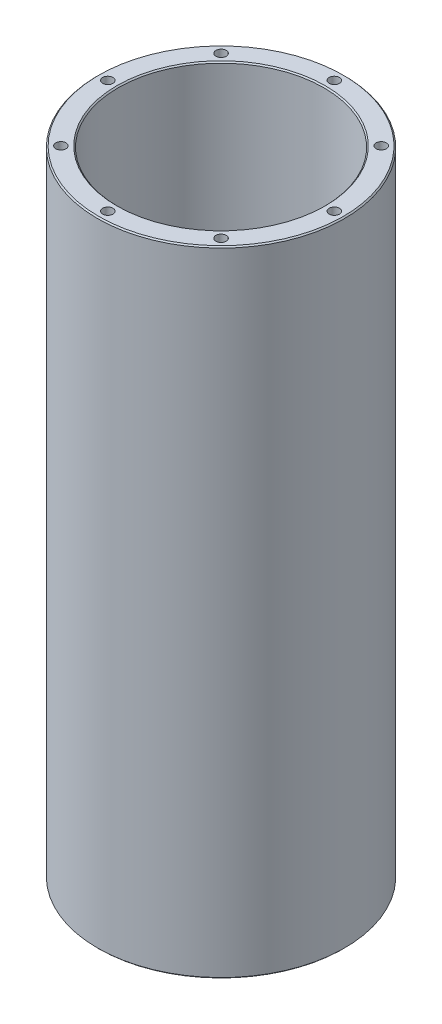
ISO-10303-21;
HEADER;
FILE_DESCRIPTION(('STEP AP214'),'2;1');
FILE_NAME('part.step','',(''),(''),'','','');
FILE_SCHEMA(('AUTOMOTIVE_DESIGN { 1 0 10303 214 1 1 1 1 }'));
ENDSEC;
DATA;
#1=APPLICATION_CONTEXT('core data for automotive mechanical design processes');
#2=APPLICATION_PROTOCOL_DEFINITION('international standard','automotive_design',2000,#1);
#3=PRODUCT_CONTEXT('',#1,'mechanical');
#4=PRODUCT('Part','Part','',(#3));
#5=PRODUCT_RELATED_PRODUCT_CATEGORY('part','',(#4));
#6=PRODUCT_DEFINITION_FORMATION('','',#4);
#7=PRODUCT_DEFINITION_CONTEXT('part definition',#1,'design');
#8=PRODUCT_DEFINITION('design','',#6,#7);
#9=PRODUCT_DEFINITION_SHAPE('','',#8);
#10=(LENGTH_UNIT() NAMED_UNIT(*) SI_UNIT(.MILLI.,.METRE.));
#11=(NAMED_UNIT(*) PLANE_ANGLE_UNIT() SI_UNIT($,.RADIAN.));
#12=(NAMED_UNIT(*) SI_UNIT($,.STERADIAN.) SOLID_ANGLE_UNIT());
#13=UNCERTAINTY_MEASURE_WITH_UNIT(LENGTH_MEASURE(1.E-05),#10,'distance_accuracy_value','');
#14=(GEOMETRIC_REPRESENTATION_CONTEXT(3) GLOBAL_UNCERTAINTY_ASSIGNED_CONTEXT((#13)) GLOBAL_UNIT_ASSIGNED_CONTEXT((#10,
#11,#12)) REPRESENTATION_CONTEXT('',''));
#15=CARTESIAN_POINT('',(0.,0.,0.));
#16=DIRECTION('',(0.,0.,1.));
#17=DIRECTION('',(1.,0.,0.));
#18=AXIS2_PLACEMENT_3D('',#15,#16,#17);
#19=CARTESIAN_POINT('',(0.,154.,0.));
#20=DIRECTION('',(0.,1.,0.));
#21=DIRECTION('',(0.,0.,1.));
#22=AXIS2_PLACEMENT_3D('',#19,#20,#21);
#23=PLANE('',#22);
#24=CARTESIAN_POINT('',(0.,154.,0.));
#25=DIRECTION('',(0.,1.,0.));
#26=DIRECTION('',(0.,0.,1.));
#27=AXIS2_PLACEMENT_3D('',#24,#25,#26);
#28=CIRCLE('',#27,50.6);
#29=CARTESIAN_POINT('',(0.,154.,50.6));
#30=VERTEX_POINT('',#29);
#31=EDGE_CURVE('E14',#30,#30,#28,.F.);
#32=ORIENTED_EDGE('',*,*,#31,.T.);
#33=EDGE_LOOP('',(#32));
#34=FACE_BOUND('',#33,.T.);
#35=CARTESIAN_POINT('',(0.,154.,0.));
#36=DIRECTION('',(0.,1.,0.));
#37=DIRECTION('',(0.,0.,1.));
#38=AXIS2_PLACEMENT_3D('',#35,#36,#37);
#39=CIRCLE('',#38,59.4);
#40=CARTESIAN_POINT('',(0.,154.,59.4));
#41=VERTEX_POINT('',#40);
#42=EDGE_CURVE('E177',#41,#41,#39,.T.);
#43=ORIENTED_EDGE('',*,*,#42,.T.);
#44=EDGE_LOOP('',(#43));
#45=FACE_BOUND('',#44,.T.);
#46=CARTESIAN_POINT('',(0.,154.,-55.));
#47=DIRECTION('',(0.,1.,0.));
#48=DIRECTION('',(0.,0.,1.));
#49=AXIS2_PLACEMENT_3D('',#46,#47,#48);
#50=CIRCLE('',#49,2.49999999999999);
#51=CARTESIAN_POINT('',(0.,154.,-52.5));
#52=VERTEX_POINT('',#51);
#53=EDGE_CURVE('E312',#52,#52,#50,.T.);
#54=ORIENTED_EDGE('',*,*,#53,.F.);
#55=EDGE_LOOP('',(#54));
#56=FACE_BOUND('',#55,.T.);
#57=CARTESIAN_POINT('',(38.8908729652619,154.,-38.8908729652583));
#58=DIRECTION('',(0.,1.,0.));
#59=DIRECTION('',(0.,0.,1.));
#60=AXIS2_PLACEMENT_3D('',#57,#58,#59);
#61=CIRCLE('',#60,2.49999999999999);
#62=CARTESIAN_POINT('',(38.8908729652619,154.,-36.3908729652583));
#63=VERTEX_POINT('',#62);
#64=EDGE_CURVE('E320',#63,#63,#61,.T.);
#65=ORIENTED_EDGE('',*,*,#64,.F.);
#66=EDGE_LOOP('',(#65));
#67=FACE_BOUND('',#66,.T.);
#68=CARTESIAN_POINT('',(55.,154.,5.19321613705065E-12));
#69=DIRECTION('',(0.,1.,0.));
#70=DIRECTION('',(0.,0.,1.));
#71=AXIS2_PLACEMENT_3D('',#68,#69,#70);
#72=CIRCLE('',#71,2.49999999999999);
#73=CARTESIAN_POINT('',(55.,154.,2.50000000000518));
#74=VERTEX_POINT('',#73);
#75=EDGE_CURVE('E328',#74,#74,#72,.T.);
#76=ORIENTED_EDGE('',*,*,#75,.F.);
#77=EDGE_LOOP('',(#76));
#78=FACE_BOUND('',#77,.T.);
#79=CARTESIAN_POINT('',(38.8908729652546,154.,38.8908729652656));
#80=DIRECTION('',(0.,1.,0.));
#81=DIRECTION('',(0.,0.,1.));
#82=AXIS2_PLACEMENT_3D('',#79,#80,#81);
#83=CIRCLE('',#82,2.49999999999999);
#84=CARTESIAN_POINT('',(38.8908729652546,154.,41.3908729652656));
#85=VERTEX_POINT('',#84);
#86=EDGE_CURVE('E336',#85,#85,#83,.T.);
#87=ORIENTED_EDGE('',*,*,#86,.F.);
#88=EDGE_LOOP('',(#87));
#89=FACE_BOUND('',#88,.T.);
#90=CARTESIAN_POINT('',(-1.03923534517465E-11,154.,55.));
#91=DIRECTION('',(0.,1.,0.));
#92=DIRECTION('',(0.,0.,1.));
#93=AXIS2_PLACEMENT_3D('',#90,#91,#92);
#94=CIRCLE('',#93,2.49999999999999);
#95=CARTESIAN_POINT('',(-1.03923534517465E-11,154.,57.5));
#96=VERTEX_POINT('',#95);
#97=EDGE_CURVE('E344',#96,#96,#94,.T.);
#98=ORIENTED_EDGE('',*,*,#97,.F.);
#99=EDGE_LOOP('',(#98));
#100=FACE_BOUND('',#99,.T.);
#101=CARTESIAN_POINT('',(-38.8908729652693,154.,38.8908729652509));
#102=DIRECTION('',(0.,1.,0.));
#103=DIRECTION('',(0.,0.,1.));
#104=AXIS2_PLACEMENT_3D('',#101,#102,#103);
#105=CIRCLE('',#104,2.49999999999999);
#106=CARTESIAN_POINT('',(-38.8908729652693,154.,41.3908729652509));
#107=VERTEX_POINT('',#106);
#108=EDGE_CURVE('E352',#107,#107,#105,.T.);
#109=ORIENTED_EDGE('',*,*,#108,.F.);
#110=EDGE_LOOP('',(#109));
#111=FACE_BOUND('',#110,.T.);
#112=CARTESIAN_POINT('',(-55.,154.,-1.56159156729841E-11));
#113=DIRECTION('',(0.,1.,0.));
#114=DIRECTION('',(0.,0.,1.));
#115=AXIS2_PLACEMENT_3D('',#112,#113,#114);
#116=CIRCLE('',#115,2.49999999999999);
#117=CARTESIAN_POINT('',(-55.,154.,2.49999999998437));
#118=VERTEX_POINT('',#117);
#119=EDGE_CURVE('E360',#118,#118,#116,.T.);
#120=ORIENTED_EDGE('',*,*,#119,.F.);
#121=EDGE_LOOP('',(#120));
#122=FACE_BOUND('',#121,.T.);
#123=CARTESIAN_POINT('',(-38.8908729652472,154.,-38.890872965273));
#124=DIRECTION('',(0.,1.,0.));
#125=DIRECTION('',(0.,0.,1.));
#126=AXIS2_PLACEMENT_3D('',#123,#124,#125);
#127=CIRCLE('',#126,2.49999999999999);
#128=CARTESIAN_POINT('',(-38.8908729652472,154.,-36.390872965273));
#129=VERTEX_POINT('',#128);
#130=EDGE_CURVE('E368',#129,#129,#127,.T.);
#131=ORIENTED_EDGE('',*,*,#130,.F.);
#132=EDGE_LOOP('',(#131));
#133=FACE_BOUND('',#132,.T.);
#134=ADVANCED_FACE('F167',(#34,#45,#56,#67,#78,#89,#100,#111,#122,#133),#23,.T.);
#135=CARTESIAN_POINT('',(0.,154.,0.));
#136=DIRECTION('',(0.,-1.,0.));
#137=DIRECTION('',(0.,0.,-1.));
#138=AXIS2_PLACEMENT_3D('',#135,#136,#137);
#139=CYLINDRICAL_SURFACE('',#138,60.);
#140=CARTESIAN_POINT('',(0.,-153.4,0.));
#141=DIRECTION('',(0.,1.,0.));
#142=DIRECTION('',(0.,0.,1.));
#143=AXIS2_PLACEMENT_3D('',#140,#141,#142);
#144=CIRCLE('',#143,60.);
#145=CARTESIAN_POINT('',(0.,-153.4,60.));
#146=VERTEX_POINT('',#145);
#147=EDGE_CURVE('E396',#146,#146,#144,.T.);
#148=ORIENTED_EDGE('',*,*,#147,.T.);
#149=EDGE_LOOP('',(#148));
#150=FACE_BOUND('',#149,.T.);
#151=CARTESIAN_POINT('',(0.,153.4,0.));
#152=DIRECTION('',(0.,1.,0.));
#153=DIRECTION('',(0.,0.,1.));
#154=AXIS2_PLACEMENT_3D('',#151,#152,#153);
#155=CIRCLE('',#154,60.);
#156=CARTESIAN_POINT('',(0.,153.4,60.));
#157=VERTEX_POINT('',#156);
#158=EDGE_CURVE('E392',#157,#157,#155,.F.);
#159=ORIENTED_EDGE('',*,*,#158,.T.);
#160=EDGE_LOOP('',(#159));
#161=FACE_BOUND('',#160,.T.);
#162=ADVANCED_FACE('F417',(#150,#161),#139,.T.);
#163=CARTESIAN_POINT('',(0.,154.,0.));
#164=DIRECTION('',(0.,-1.,0.));
#165=DIRECTION('',(0.,0.,-1.));
#166=AXIS2_PLACEMENT_3D('',#163,#164,#165);
#167=CYLINDRICAL_SURFACE('',#166,50.);
#168=CARTESIAN_POINT('',(0.,-153.4,0.));
#169=DIRECTION('',(0.,1.,0.));
#170=DIRECTION('',(0.,0.,1.));
#171=AXIS2_PLACEMENT_3D('',#168,#169,#170);
#172=CIRCLE('',#171,50.);
#173=CARTESIAN_POINT('',(0.,-153.4,50.));
#174=VERTEX_POINT('',#173);
#175=EDGE_CURVE('E388',#174,#174,#172,.F.);
#176=ORIENTED_EDGE('',*,*,#175,.T.);
#177=EDGE_LOOP('',(#176));
#178=FACE_BOUND('',#177,.T.);
#179=CARTESIAN_POINT('',(0.,153.4,0.));
#180=DIRECTION('',(0.,1.,0.));
#181=DIRECTION('',(0.,0.,1.));
#182=AXIS2_PLACEMENT_3D('',#179,#180,#181);
#183=CIRCLE('',#182,50.);
#184=CARTESIAN_POINT('',(0.,153.4,50.));
#185=VERTEX_POINT('',#184);
#186=EDGE_CURVE('E384',#185,#185,#183,.T.);
#187=ORIENTED_EDGE('',*,*,#186,.T.);
#188=EDGE_LOOP('',(#187));
#189=FACE_BOUND('',#188,.T.);
#190=ADVANCED_FACE('F425',(#178,#189),#167,.F.);
#191=CARTESIAN_POINT('',(0.,-154.,0.));
#192=DIRECTION('',(0.,1.,0.));
#193=DIRECTION('',(0.,0.,1.));
#194=AXIS2_PLACEMENT_3D('',#191,#192,#193);
#195=PLANE('',#194);
#196=CARTESIAN_POINT('',(0.,-154.,0.));
#197=DIRECTION('',(0.,1.,0.));
#198=DIRECTION('',(0.,0.,1.));
#199=AXIS2_PLACEMENT_3D('',#196,#197,#198);
#200=CIRCLE('',#199,50.6);
#201=CARTESIAN_POINT('',(0.,-154.,50.6));
#202=VERTEX_POINT('',#201);
#203=EDGE_CURVE('E380',#202,#202,#200,.T.);
#204=ORIENTED_EDGE('',*,*,#203,.T.);
#205=EDGE_LOOP('',(#204));
#206=FACE_BOUND('',#205,.T.);
#207=CARTESIAN_POINT('',(0.,-154.,0.));
#208=DIRECTION('',(0.,1.,0.));
#209=DIRECTION('',(0.,0.,1.));
#210=AXIS2_PLACEMENT_3D('',#207,#208,#209);
#211=CIRCLE('',#210,59.4);
#212=CARTESIAN_POINT('',(0.,-154.,59.4));
#213=VERTEX_POINT('',#212);
#214=EDGE_CURVE('E376',#213,#213,#211,.F.);
#215=ORIENTED_EDGE('',*,*,#214,.T.);
#216=EDGE_LOOP('',(#215));
#217=FACE_BOUND('',#216,.T.);
#218=CARTESIAN_POINT('',(0.,-154.,-55.));
#219=DIRECTION('',(0.,-1.,0.));
#220=DIRECTION('',(0.,0.,-1.));
#221=AXIS2_PLACEMENT_3D('',#218,#219,#220);
#222=CIRCLE('',#221,2.49999999999999);
#223=CARTESIAN_POINT('',(0.,-154.,-57.5));
#224=VERTEX_POINT('',#223);
#225=EDGE_CURVE('E249',#224,#224,#222,.T.);
#226=ORIENTED_EDGE('',*,*,#225,.F.);
#227=EDGE_LOOP('',(#226));
#228=FACE_BOUND('',#227,.T.);
#229=CARTESIAN_POINT('',(38.8908729652619,-154.,-38.8908729652583));
#230=DIRECTION('',(0.,-1.,0.));
#231=DIRECTION('',(0.,0.,-1.));
#232=AXIS2_PLACEMENT_3D('',#229,#230,#231);
#233=CIRCLE('',#232,2.49999999999999);
#234=CARTESIAN_POINT('',(38.8908729652619,-154.,-41.3908729652583));
#235=VERTEX_POINT('',#234);
#236=EDGE_CURVE('E248',#235,#235,#233,.T.);
#237=ORIENTED_EDGE('',*,*,#236,.F.);
#238=EDGE_LOOP('',(#237));
#239=FACE_BOUND('',#238,.T.);
#240=CARTESIAN_POINT('',(55.,-154.,5.19321613705065E-12));
#241=DIRECTION('',(0.,-1.,0.));
#242=DIRECTION('',(0.,0.,-1.));
#243=AXIS2_PLACEMENT_3D('',#240,#241,#242);
#244=CIRCLE('',#243,2.49999999999999);
#245=CARTESIAN_POINT('',(55.,-154.,-2.49999999999479));
#246=VERTEX_POINT('',#245);
#247=EDGE_CURVE('E264',#246,#246,#244,.T.);
#248=ORIENTED_EDGE('',*,*,#247,.F.);
#249=EDGE_LOOP('',(#248));
#250=FACE_BOUND('',#249,.T.);
#251=CARTESIAN_POINT('',(38.8908729652546,-154.,38.8908729652656));
#252=DIRECTION('',(0.,-1.,0.));
#253=DIRECTION('',(0.,0.,-1.));
#254=AXIS2_PLACEMENT_3D('',#251,#252,#253);
#255=CIRCLE('',#254,2.49999999999999);
#256=CARTESIAN_POINT('',(38.8908729652546,-154.,36.3908729652656));
#257=VERTEX_POINT('',#256);
#258=EDGE_CURVE('E272',#257,#257,#255,.T.);
#259=ORIENTED_EDGE('',*,*,#258,.F.);
#260=EDGE_LOOP('',(#259));
#261=FACE_BOUND('',#260,.T.);
#262=CARTESIAN_POINT('',(-1.03923534517465E-11,-154.,55.));
#263=DIRECTION('',(0.,-1.,0.));
#264=DIRECTION('',(0.,0.,-1.));
#265=AXIS2_PLACEMENT_3D('',#262,#263,#264);
#266=CIRCLE('',#265,2.49999999999999);
#267=CARTESIAN_POINT('',(-1.03923534517465E-11,-154.,52.5));
#268=VERTEX_POINT('',#267);
#269=EDGE_CURVE('E280',#268,#268,#266,.T.);
#270=ORIENTED_EDGE('',*,*,#269,.F.);
#271=EDGE_LOOP('',(#270));
#272=FACE_BOUND('',#271,.T.);
#273=CARTESIAN_POINT('',(-38.8908729652693,-154.,38.8908729652509));
#274=DIRECTION('',(0.,-1.,0.));
#275=DIRECTION('',(0.,0.,-1.));
#276=AXIS2_PLACEMENT_3D('',#273,#274,#275);
#277=CIRCLE('',#276,2.49999999999999);
#278=CARTESIAN_POINT('',(-38.8908729652693,-154.,36.390872965251));
#279=VERTEX_POINT('',#278);
#280=EDGE_CURVE('E288',#279,#279,#277,.T.);
#281=ORIENTED_EDGE('',*,*,#280,.F.);
#282=EDGE_LOOP('',(#281));
#283=FACE_BOUND('',#282,.T.);
#284=CARTESIAN_POINT('',(-55.,-154.,-1.56159156729841E-11));
#285=DIRECTION('',(0.,-1.,0.));
#286=DIRECTION('',(0.,0.,-1.));
#287=AXIS2_PLACEMENT_3D('',#284,#285,#286);
#288=CIRCLE('',#287,2.49999999999999);
#289=CARTESIAN_POINT('',(-55.,-154.,-2.5000000000156));
#290=VERTEX_POINT('',#289);
#291=EDGE_CURVE('E296',#290,#290,#288,.T.);
#292=ORIENTED_EDGE('',*,*,#291,.F.);
#293=EDGE_LOOP('',(#292));
#294=FACE_BOUND('',#293,.T.);
#295=CARTESIAN_POINT('',(-38.8908729652472,-154.,-38.890872965273));
#296=DIRECTION('',(0.,-1.,0.));
#297=DIRECTION('',(0.,0.,-1.));
#298=AXIS2_PLACEMENT_3D('',#295,#296,#297);
#299=CIRCLE('',#298,2.49999999999999);
#300=CARTESIAN_POINT('',(-38.8908729652472,-154.,-41.390872965273));
#301=VERTEX_POINT('',#300);
#302=EDGE_CURVE('E304',#301,#301,#299,.T.);
#303=ORIENTED_EDGE('',*,*,#302,.F.);
#304=EDGE_LOOP('',(#303));
#305=FACE_BOUND('',#304,.T.);
#306=ADVANCED_FACE('F455',(#206,#217,#228,#239,#250,#261,#272,#283,#294,#305),#195,.F.);
#307=CARTESIAN_POINT('',(-38.8908729652472,139.,-38.890872965273));
#308=DIRECTION('',(0.,1.,0.));
#309=DIRECTION('',(0.,0.,1.));
#310=AXIS2_PLACEMENT_3D('',#307,#308,#309);
#311=CONICAL_SURFACE('',#310,2.49999999999999,1.02974425867665);
#312=CARTESIAN_POINT('',(-38.8908729652473,137.497848452431,-38.890872965273));
#313=VERTEX_POINT('',#312);
#314=VERTEX_LOOP('',#313);
#315=FACE_BOUND('',#314,.T.);
#316=CARTESIAN_POINT('',(-38.8908729652472,139.,-38.890872965273));
#317=DIRECTION('',(0.,1.,0.));
#318=DIRECTION('',(0.,0.,1.));
#319=AXIS2_PLACEMENT_3D('',#316,#317,#318);
#320=CIRCLE('',#319,2.49999999999999);
#321=CARTESIAN_POINT('',(-38.8908729652472,139.,-36.390872965273));
#322=VERTEX_POINT('',#321);
#323=EDGE_CURVE('E372',#322,#322,#320,.T.);
#324=ORIENTED_EDGE('',*,*,#323,.T.);
#325=EDGE_LOOP('',(#324));
#326=FACE_BOUND('',#325,.T.);
#327=ADVANCED_FACE('F458',(#315,#326),#311,.F.);
#328=CARTESIAN_POINT('',(-38.8908729652472,154.,-38.890872965273));
#329=DIRECTION('',(0.,1.,0.));
#330=DIRECTION('',(0.,0.,1.));
#331=AXIS2_PLACEMENT_3D('',#328,#329,#330);
#332=CYLINDRICAL_SURFACE('',#331,2.49999999999999);
#333=ORIENTED_EDGE('',*,*,#323,.F.);
#334=EDGE_LOOP('',(#333));
#335=FACE_BOUND('',#334,.T.);
#336=ORIENTED_EDGE('',*,*,#130,.T.);
#337=EDGE_LOOP('',(#336));
#338=FACE_BOUND('',#337,.T.);
#339=ADVANCED_FACE('F549',(#335,#338),#332,.F.);
#340=CARTESIAN_POINT('',(-55.,139.,-1.56159156729841E-11));
#341=DIRECTION('',(0.,1.,0.));
#342=DIRECTION('',(0.,0.,1.));
#343=AXIS2_PLACEMENT_3D('',#340,#341,#342);
#344=CONICAL_SURFACE('',#343,2.49999999999999,1.02974425867665);
#345=CARTESIAN_POINT('',(-55.,137.497848452431,-1.56159156729841E-11));
#346=VERTEX_POINT('',#345);
#347=VERTEX_LOOP('',#346);
#348=FACE_BOUND('',#347,.T.);
#349=CARTESIAN_POINT('',(-55.,139.,-1.56159156729841E-11));
#350=DIRECTION('',(0.,1.,0.));
#351=DIRECTION('',(0.,0.,1.));
#352=AXIS2_PLACEMENT_3D('',#349,#350,#351);
#353=CIRCLE('',#352,2.49999999999999);
#354=CARTESIAN_POINT('',(-55.,139.,2.49999999998437));
#355=VERTEX_POINT('',#354);
#356=EDGE_CURVE('E364',#355,#355,#353,.T.);
#357=ORIENTED_EDGE('',*,*,#356,.T.);
#358=EDGE_LOOP('',(#357));
#359=FACE_BOUND('',#358,.T.);
#360=ADVANCED_FACE('F545',(#348,#359),#344,.F.);
#361=CARTESIAN_POINT('',(-55.,154.,-1.56159156729841E-11));
#362=DIRECTION('',(0.,1.,0.));
#363=DIRECTION('',(0.,0.,1.));
#364=AXIS2_PLACEMENT_3D('',#361,#362,#363);
#365=CYLINDRICAL_SURFACE('',#364,2.49999999999999);
#366=ORIENTED_EDGE('',*,*,#356,.F.);
#367=EDGE_LOOP('',(#366));
#368=FACE_BOUND('',#367,.T.);
#369=ORIENTED_EDGE('',*,*,#119,.T.);
#370=EDGE_LOOP('',(#369));
#371=FACE_BOUND('',#370,.T.);
#372=ADVANCED_FACE('F541',(#368,#371),#365,.F.);
#373=CARTESIAN_POINT('',(-38.8908729652693,139.,38.8908729652509));
#374=DIRECTION('',(0.,1.,0.));
#375=DIRECTION('',(0.,0.,1.));
#376=AXIS2_PLACEMENT_3D('',#373,#374,#375);
#377=CONICAL_SURFACE('',#376,2.49999999999999,1.02974425867665);
#378=CARTESIAN_POINT('',(-38.8908729652693,137.497848452431,38.8908729652509));
#379=VERTEX_POINT('',#378);
#380=VERTEX_LOOP('',#379);
#381=FACE_BOUND('',#380,.T.);
#382=CARTESIAN_POINT('',(-38.8908729652693,139.,38.8908729652509));
#383=DIRECTION('',(0.,1.,0.));
#384=DIRECTION('',(0.,0.,1.));
#385=AXIS2_PLACEMENT_3D('',#382,#383,#384);
#386=CIRCLE('',#385,2.49999999999999);
#387=CARTESIAN_POINT('',(-38.8908729652693,139.,41.3908729652509));
#388=VERTEX_POINT('',#387);
#389=EDGE_CURVE('E356',#388,#388,#386,.T.);
#390=ORIENTED_EDGE('',*,*,#389,.T.);
#391=EDGE_LOOP('',(#390));
#392=FACE_BOUND('',#391,.T.);
#393=ADVANCED_FACE('F537',(#381,#392),#377,.F.);
#394=CARTESIAN_POINT('',(-38.8908729652693,154.,38.8908729652509));
#395=DIRECTION('',(0.,1.,0.));
#396=DIRECTION('',(0.,0.,1.));
#397=AXIS2_PLACEMENT_3D('',#394,#395,#396);
#398=CYLINDRICAL_SURFACE('',#397,2.49999999999999);
#399=ORIENTED_EDGE('',*,*,#389,.F.);
#400=EDGE_LOOP('',(#399));
#401=FACE_BOUND('',#400,.T.);
#402=ORIENTED_EDGE('',*,*,#108,.T.);
#403=EDGE_LOOP('',(#402));
#404=FACE_BOUND('',#403,.T.);
#405=ADVANCED_FACE('F533',(#401,#404),#398,.F.);
#406=CARTESIAN_POINT('',(-1.03923534517465E-11,139.,55.));
#407=DIRECTION('',(0.,1.,0.));
#408=DIRECTION('',(0.,0.,1.));
#409=AXIS2_PLACEMENT_3D('',#406,#407,#408);
#410=CONICAL_SURFACE('',#409,2.49999999999999,1.02974425867665);
#411=CARTESIAN_POINT('',(-1.03963953131608E-11,137.497848452431,55.));
#412=VERTEX_POINT('',#411);
#413=VERTEX_LOOP('',#412);
#414=FACE_BOUND('',#413,.T.);
#415=CARTESIAN_POINT('',(-1.03923534517465E-11,139.,55.));
#416=DIRECTION('',(0.,1.,0.));
#417=DIRECTION('',(0.,0.,1.));
#418=AXIS2_PLACEMENT_3D('',#415,#416,#417);
#419=CIRCLE('',#418,2.49999999999999);
#420=CARTESIAN_POINT('',(-1.03923534517465E-11,139.,57.5));
#421=VERTEX_POINT('',#420);
#422=EDGE_CURVE('E348',#421,#421,#419,.T.);
#423=ORIENTED_EDGE('',*,*,#422,.T.);
#424=EDGE_LOOP('',(#423));
#425=FACE_BOUND('',#424,.T.);
#426=ADVANCED_FACE('F529',(#414,#425),#410,.F.);
#427=CARTESIAN_POINT('',(-1.03923534517465E-11,154.,55.));
#428=DIRECTION('',(0.,1.,0.));
#429=DIRECTION('',(0.,0.,1.));
#430=AXIS2_PLACEMENT_3D('',#427,#428,#429);
#431=CYLINDRICAL_SURFACE('',#430,2.49999999999999);
#432=ORIENTED_EDGE('',*,*,#422,.F.);
#433=EDGE_LOOP('',(#432));
#434=FACE_BOUND('',#433,.T.);
#435=ORIENTED_EDGE('',*,*,#97,.T.);
#436=EDGE_LOOP('',(#435));
#437=FACE_BOUND('',#436,.T.);
#438=ADVANCED_FACE('F525',(#434,#437),#431,.F.);
#439=CARTESIAN_POINT('',(38.8908729652546,139.,38.8908729652656));
#440=DIRECTION('',(0.,1.,0.));
#441=DIRECTION('',(0.,0.,1.));
#442=AXIS2_PLACEMENT_3D('',#439,#440,#441);
#443=CONICAL_SURFACE('',#442,2.49999999999999,1.02974425867665);
#444=CARTESIAN_POINT('',(38.8908729652546,137.497848452431,38.8908729652656));
#445=VERTEX_POINT('',#444);
#446=VERTEX_LOOP('',#445);
#447=FACE_BOUND('',#446,.T.);
#448=CARTESIAN_POINT('',(38.8908729652546,139.,38.8908729652656));
#449=DIRECTION('',(0.,1.,0.));
#450=DIRECTION('',(0.,0.,1.));
#451=AXIS2_PLACEMENT_3D('',#448,#449,#450);
#452=CIRCLE('',#451,2.49999999999999);
#453=CARTESIAN_POINT('',(38.8908729652546,139.,41.3908729652656));
#454=VERTEX_POINT('',#453);
#455=EDGE_CURVE('E340',#454,#454,#452,.T.);
#456=ORIENTED_EDGE('',*,*,#455,.T.);
#457=EDGE_LOOP('',(#456));
#458=FACE_BOUND('',#457,.T.);
#459=ADVANCED_FACE('F521',(#447,#458),#443,.F.);
#460=CARTESIAN_POINT('',(38.8908729652546,154.,38.8908729652656));
#461=DIRECTION('',(0.,1.,0.));
#462=DIRECTION('',(0.,0.,1.));
#463=AXIS2_PLACEMENT_3D('',#460,#461,#462);
#464=CYLINDRICAL_SURFACE('',#463,2.49999999999999);
#465=ORIENTED_EDGE('',*,*,#455,.F.);
#466=EDGE_LOOP('',(#465));
#467=FACE_BOUND('',#466,.T.);
#468=ORIENTED_EDGE('',*,*,#86,.T.);
#469=EDGE_LOOP('',(#468));
#470=FACE_BOUND('',#469,.T.);
#471=ADVANCED_FACE('F517',(#467,#470),#464,.F.);
#472=CARTESIAN_POINT('',(55.,139.,5.19321613705065E-12));
#473=DIRECTION('',(0.,1.,0.));
#474=DIRECTION('',(0.,0.,1.));
#475=AXIS2_PLACEMENT_3D('',#472,#473,#474);
#476=CONICAL_SURFACE('',#475,2.49999999999999,1.02974425867665);
#477=CARTESIAN_POINT('',(55.,137.497848452431,5.19321613705065E-12));
#478=VERTEX_POINT('',#477);
#479=VERTEX_LOOP('',#478);
#480=FACE_BOUND('',#479,.T.);
#481=CARTESIAN_POINT('',(55.,139.,5.19321613705065E-12));
#482=DIRECTION('',(0.,1.,0.));
#483=DIRECTION('',(0.,0.,1.));
#484=AXIS2_PLACEMENT_3D('',#481,#482,#483);
#485=CIRCLE('',#484,2.49999999999999);
#486=CARTESIAN_POINT('',(55.,139.,2.50000000000518));
#487=VERTEX_POINT('',#486);
#488=EDGE_CURVE('E332',#487,#487,#485,.T.);
#489=ORIENTED_EDGE('',*,*,#488,.T.);
#490=EDGE_LOOP('',(#489));
#491=FACE_BOUND('',#490,.T.);
#492=ADVANCED_FACE('F513',(#480,#491),#476,.F.);
#493=CARTESIAN_POINT('',(55.,154.,5.19321613705065E-12));
#494=DIRECTION('',(0.,1.,0.));
#495=DIRECTION('',(0.,0.,1.));
#496=AXIS2_PLACEMENT_3D('',#493,#494,#495);
#497=CYLINDRICAL_SURFACE('',#496,2.49999999999999);
#498=ORIENTED_EDGE('',*,*,#488,.F.);
#499=EDGE_LOOP('',(#498));
#500=FACE_BOUND('',#499,.T.);
#501=ORIENTED_EDGE('',*,*,#75,.T.);
#502=EDGE_LOOP('',(#501));
#503=FACE_BOUND('',#502,.T.);
#504=ADVANCED_FACE('F509',(#500,#503),#497,.F.);
#505=CARTESIAN_POINT('',(38.8908729652619,139.,-38.8908729652583));
#506=DIRECTION('',(0.,1.,0.));
#507=DIRECTION('',(0.,0.,1.));
#508=AXIS2_PLACEMENT_3D('',#505,#506,#507);
#509=CONICAL_SURFACE('',#508,2.49999999999999,1.02974425867665);
#510=CARTESIAN_POINT('',(38.8908729652619,137.497848452431,-38.8908729652583));
#511=VERTEX_POINT('',#510);
#512=VERTEX_LOOP('',#511);
#513=FACE_BOUND('',#512,.T.);
#514=CARTESIAN_POINT('',(38.8908729652619,139.,-38.8908729652583));
#515=DIRECTION('',(0.,1.,0.));
#516=DIRECTION('',(0.,0.,1.));
#517=AXIS2_PLACEMENT_3D('',#514,#515,#516);
#518=CIRCLE('',#517,2.49999999999999);
#519=CARTESIAN_POINT('',(38.8908729652619,139.,-36.3908729652583));
#520=VERTEX_POINT('',#519);
#521=EDGE_CURVE('E324',#520,#520,#518,.T.);
#522=ORIENTED_EDGE('',*,*,#521,.T.);
#523=EDGE_LOOP('',(#522));
#524=FACE_BOUND('',#523,.T.);
#525=ADVANCED_FACE('F505',(#513,#524),#509,.F.);
#526=CARTESIAN_POINT('',(38.8908729652619,154.,-38.8908729652583));
#527=DIRECTION('',(0.,1.,0.));
#528=DIRECTION('',(0.,0.,1.));
#529=AXIS2_PLACEMENT_3D('',#526,#527,#528);
#530=CYLINDRICAL_SURFACE('',#529,2.49999999999999);
#531=ORIENTED_EDGE('',*,*,#521,.F.);
#532=EDGE_LOOP('',(#531));
#533=FACE_BOUND('',#532,.T.);
#534=ORIENTED_EDGE('',*,*,#64,.T.);
#535=EDGE_LOOP('',(#534));
#536=FACE_BOUND('',#535,.T.);
#537=ADVANCED_FACE('F501',(#533,#536),#530,.F.);
#538=CARTESIAN_POINT('',(0.,139.,-55.));
#539=DIRECTION('',(0.,1.,0.));
#540=DIRECTION('',(0.,0.,1.));
#541=AXIS2_PLACEMENT_3D('',#538,#539,#540);
#542=CONICAL_SURFACE('',#541,2.49999999999999,1.02974425867665);
#543=CARTESIAN_POINT('',(0.,137.497848452431,-55.));
#544=VERTEX_POINT('',#543);
#545=VERTEX_LOOP('',#544);
#546=FACE_BOUND('',#545,.T.);
#547=CARTESIAN_POINT('',(0.,139.,-55.));
#548=DIRECTION('',(0.,1.,0.));
#549=DIRECTION('',(0.,0.,1.));
#550=AXIS2_PLACEMENT_3D('',#547,#548,#549);
#551=CIRCLE('',#550,2.49999999999999);
#552=CARTESIAN_POINT('',(0.,139.,-52.5));
#553=VERTEX_POINT('',#552);
#554=EDGE_CURVE('E316',#553,#553,#551,.T.);
#555=ORIENTED_EDGE('',*,*,#554,.T.);
#556=EDGE_LOOP('',(#555));
#557=FACE_BOUND('',#556,.T.);
#558=ADVANCED_FACE('F497',(#546,#557),#542,.F.);
#559=CARTESIAN_POINT('',(0.,154.,-55.));
#560=DIRECTION('',(0.,1.,0.));
#561=DIRECTION('',(0.,0.,1.));
#562=AXIS2_PLACEMENT_3D('',#559,#560,#561);
#563=CYLINDRICAL_SURFACE('',#562,2.49999999999999);
#564=ORIENTED_EDGE('',*,*,#554,.F.);
#565=EDGE_LOOP('',(#564));
#566=FACE_BOUND('',#565,.T.);
#567=ORIENTED_EDGE('',*,*,#53,.T.);
#568=EDGE_LOOP('',(#567));
#569=FACE_BOUND('',#568,.T.);
#570=ADVANCED_FACE('F489',(#566,#569),#563,.F.);
#571=CARTESIAN_POINT('',(-38.8908729652472,-139.,-38.890872965273));
#572=DIRECTION('',(0.,-1.,0.));
#573=DIRECTION('',(0.,0.,-1.));
#574=AXIS2_PLACEMENT_3D('',#571,#572,#573);
#575=CONICAL_SURFACE('',#574,2.49999999999999,1.02974425867665);
#576=CARTESIAN_POINT('',(-38.8908729652473,-137.497848452431,-38.890872965273));
#577=VERTEX_POINT('',#576);
#578=VERTEX_LOOP('',#577);
#579=FACE_BOUND('',#578,.T.);
#580=CARTESIAN_POINT('',(-38.8908729652472,-139.,-38.890872965273));
#581=DIRECTION('',(0.,-1.,0.));
#582=DIRECTION('',(0.,0.,-1.));
#583=AXIS2_PLACEMENT_3D('',#580,#581,#582);
#584=CIRCLE('',#583,2.49999999999999);
#585=CARTESIAN_POINT('',(-38.8908729652472,-139.,-41.390872965273));
#586=VERTEX_POINT('',#585);
#587=EDGE_CURVE('E308',#586,#586,#584,.T.);
#588=ORIENTED_EDGE('',*,*,#587,.T.);
#589=EDGE_LOOP('',(#588));
#590=FACE_BOUND('',#589,.T.);
#591=ADVANCED_FACE('F479',(#579,#590),#575,.F.);
#592=CARTESIAN_POINT('',(-38.8908729652472,-154.,-38.890872965273));
#593=DIRECTION('',(0.,-1.,0.));
#594=DIRECTION('',(0.,0.,-1.));
#595=AXIS2_PLACEMENT_3D('',#592,#593,#594);
#596=CYLINDRICAL_SURFACE('',#595,2.49999999999999);
#597=ORIENTED_EDGE('',*,*,#587,.F.);
#598=EDGE_LOOP('',(#597));
#599=FACE_BOUND('',#598,.T.);
#600=ORIENTED_EDGE('',*,*,#302,.T.);
#601=EDGE_LOOP('',(#600));
#602=FACE_BOUND('',#601,.T.);
#603=ADVANCED_FACE('F476',(#599,#602),#596,.F.);
#604=CARTESIAN_POINT('',(-55.,-139.,-1.56159156729841E-11));
#605=DIRECTION('',(0.,-1.,0.));
#606=DIRECTION('',(0.,0.,-1.));
#607=AXIS2_PLACEMENT_3D('',#604,#605,#606);
#608=CONICAL_SURFACE('',#607,2.49999999999999,1.02974425867665);
#609=CARTESIAN_POINT('',(-55.,-137.497848452431,-1.56159156729841E-11));
#610=VERTEX_POINT('',#609);
#611=VERTEX_LOOP('',#610);
#612=FACE_BOUND('',#611,.T.);
#613=CARTESIAN_POINT('',(-55.,-139.,-1.56159156729841E-11));
#614=DIRECTION('',(0.,-1.,0.));
#615=DIRECTION('',(0.,0.,-1.));
#616=AXIS2_PLACEMENT_3D('',#613,#614,#615);
#617=CIRCLE('',#616,2.49999999999999);
#618=CARTESIAN_POINT('',(-55.,-139.,-2.5000000000156));
#619=VERTEX_POINT('',#618);
#620=EDGE_CURVE('E300',#619,#619,#617,.T.);
#621=ORIENTED_EDGE('',*,*,#620,.T.);
#622=EDGE_LOOP('',(#621));
#623=FACE_BOUND('',#622,.T.);
#624=ADVANCED_FACE('F478',(#612,#623),#608,.F.);
#625=CARTESIAN_POINT('',(-55.,-154.,-1.56159156729841E-11));
#626=DIRECTION('',(0.,-1.,0.));
#627=DIRECTION('',(0.,0.,-1.));
#628=AXIS2_PLACEMENT_3D('',#625,#626,#627);
#629=CYLINDRICAL_SURFACE('',#628,2.49999999999999);
#630=ORIENTED_EDGE('',*,*,#620,.F.);
#631=EDGE_LOOP('',(#630));
#632=FACE_BOUND('',#631,.T.);
#633=ORIENTED_EDGE('',*,*,#291,.T.);
#634=EDGE_LOOP('',(#633));
#635=FACE_BOUND('',#634,.T.);
#636=ADVANCED_FACE('F486',(#632,#635),#629,.F.);
#637=CARTESIAN_POINT('',(-38.8908729652693,-139.,38.8908729652509));
#638=DIRECTION('',(0.,-1.,0.));
#639=DIRECTION('',(0.,0.,-1.));
#640=AXIS2_PLACEMENT_3D('',#637,#638,#639);
#641=CONICAL_SURFACE('',#640,2.49999999999999,1.02974425867665);
#642=CARTESIAN_POINT('',(-38.8908729652693,-137.497848452431,38.8908729652509));
#643=VERTEX_POINT('',#642);
#644=VERTEX_LOOP('',#643);
#645=FACE_BOUND('',#644,.T.);
#646=CARTESIAN_POINT('',(-38.8908729652693,-139.,38.8908729652509));
#647=DIRECTION('',(0.,-1.,0.));
#648=DIRECTION('',(0.,0.,-1.));
#649=AXIS2_PLACEMENT_3D('',#646,#647,#648);
#650=CIRCLE('',#649,2.49999999999999);
#651=CARTESIAN_POINT('',(-38.8908729652693,-139.,36.390872965251));
#652=VERTEX_POINT('',#651);
#653=EDGE_CURVE('E292',#652,#652,#650,.T.);
#654=ORIENTED_EDGE('',*,*,#653,.T.);
#655=EDGE_LOOP('',(#654));
#656=FACE_BOUND('',#655,.T.);
#657=ADVANCED_FACE('F665',(#645,#656),#641,.F.);
#658=CARTESIAN_POINT('',(-38.8908729652693,-154.,38.8908729652509));
#659=DIRECTION('',(0.,-1.,0.));
#660=DIRECTION('',(0.,0.,-1.));
#661=AXIS2_PLACEMENT_3D('',#658,#659,#660);
#662=CYLINDRICAL_SURFACE('',#661,2.49999999999999);
#663=ORIENTED_EDGE('',*,*,#653,.F.);
#664=EDGE_LOOP('',(#663));
#665=FACE_BOUND('',#664,.T.);
#666=ORIENTED_EDGE('',*,*,#280,.T.);
#667=EDGE_LOOP('',(#666));
#668=FACE_BOUND('',#667,.T.);
#669=ADVANCED_FACE('F675',(#665,#668),#662,.F.);
#670=CARTESIAN_POINT('',(-1.03923534517465E-11,-139.,55.));
#671=DIRECTION('',(0.,-1.,0.));
#672=DIRECTION('',(0.,0.,-1.));
#673=AXIS2_PLACEMENT_3D('',#670,#671,#672);
#674=CONICAL_SURFACE('',#673,2.49999999999999,1.02974425867665);
#675=CARTESIAN_POINT('',(-1.03963953131608E-11,-137.497848452431,55.));
#676=VERTEX_POINT('',#675);
#677=VERTEX_LOOP('',#676);
#678=FACE_BOUND('',#677,.T.);
#679=CARTESIAN_POINT('',(-1.03923534517465E-11,-139.,55.));
#680=DIRECTION('',(0.,-1.,0.));
#681=DIRECTION('',(0.,0.,-1.));
#682=AXIS2_PLACEMENT_3D('',#679,#680,#681);
#683=CIRCLE('',#682,2.49999999999999);
#684=CARTESIAN_POINT('',(-1.03923534517465E-11,-139.,52.5));
#685=VERTEX_POINT('',#684);
#686=EDGE_CURVE('E284',#685,#685,#683,.T.);
#687=ORIENTED_EDGE('',*,*,#686,.T.);
#688=EDGE_LOOP('',(#687));
#689=FACE_BOUND('',#688,.T.);
#690=ADVANCED_FACE('F686',(#678,#689),#674,.F.);
#691=CARTESIAN_POINT('',(-1.03923534517465E-11,-154.,55.));
#692=DIRECTION('',(0.,-1.,0.));
#693=DIRECTION('',(0.,0.,-1.));
#694=AXIS2_PLACEMENT_3D('',#691,#692,#693);
#695=CYLINDRICAL_SURFACE('',#694,2.49999999999999);
#696=ORIENTED_EDGE('',*,*,#686,.F.);
#697=EDGE_LOOP('',(#696));
#698=FACE_BOUND('',#697,.T.);
#699=ORIENTED_EDGE('',*,*,#269,.T.);
#700=EDGE_LOOP('',(#699));
#701=FACE_BOUND('',#700,.T.);
#702=ADVANCED_FACE('F697',(#698,#701),#695,.F.);
#703=CARTESIAN_POINT('',(38.8908729652546,-139.,38.8908729652656));
#704=DIRECTION('',(0.,-1.,0.));
#705=DIRECTION('',(0.,0.,-1.));
#706=AXIS2_PLACEMENT_3D('',#703,#704,#705);
#707=CONICAL_SURFACE('',#706,2.49999999999999,1.02974425867665);
#708=CARTESIAN_POINT('',(38.8908729652546,-137.497848452431,38.8908729652656));
#709=VERTEX_POINT('',#708);
#710=VERTEX_LOOP('',#709);
#711=FACE_BOUND('',#710,.T.);
#712=CARTESIAN_POINT('',(38.8908729652546,-139.,38.8908729652656));
#713=DIRECTION('',(0.,-1.,0.));
#714=DIRECTION('',(0.,0.,-1.));
#715=AXIS2_PLACEMENT_3D('',#712,#713,#714);
#716=CIRCLE('',#715,2.49999999999999);
#717=CARTESIAN_POINT('',(38.8908729652546,-139.,36.3908729652656));
#718=VERTEX_POINT('',#717);
#719=EDGE_CURVE('E276',#718,#718,#716,.T.);
#720=ORIENTED_EDGE('',*,*,#719,.T.);
#721=EDGE_LOOP('',(#720));
#722=FACE_BOUND('',#721,.T.);
#723=ADVANCED_FACE('F708',(#711,#722),#707,.F.);
#724=CARTESIAN_POINT('',(38.8908729652546,-154.,38.8908729652656));
#725=DIRECTION('',(0.,-1.,0.));
#726=DIRECTION('',(0.,0.,-1.));
#727=AXIS2_PLACEMENT_3D('',#724,#725,#726);
#728=CYLINDRICAL_SURFACE('',#727,2.49999999999999);
#729=ORIENTED_EDGE('',*,*,#719,.F.);
#730=EDGE_LOOP('',(#729));
#731=FACE_BOUND('',#730,.T.);
#732=ORIENTED_EDGE('',*,*,#258,.T.);
#733=EDGE_LOOP('',(#732));
#734=FACE_BOUND('',#733,.T.);
#735=ADVANCED_FACE('F719',(#731,#734),#728,.F.);
#736=CARTESIAN_POINT('',(55.,-139.,5.19321613705065E-12));
#737=DIRECTION('',(0.,-1.,0.));
#738=DIRECTION('',(0.,0.,-1.));
#739=AXIS2_PLACEMENT_3D('',#736,#737,#738);
#740=CONICAL_SURFACE('',#739,2.49999999999999,1.02974425867665);
#741=CARTESIAN_POINT('',(55.,-137.497848452431,5.19321613705065E-12));
#742=VERTEX_POINT('',#741);
#743=VERTEX_LOOP('',#742);
#744=FACE_BOUND('',#743,.T.);
#745=CARTESIAN_POINT('',(55.,-139.,5.19321613705065E-12));
#746=DIRECTION('',(0.,-1.,0.));
#747=DIRECTION('',(0.,0.,-1.));
#748=AXIS2_PLACEMENT_3D('',#745,#746,#747);
#749=CIRCLE('',#748,2.49999999999999);
#750=CARTESIAN_POINT('',(55.,-139.,-2.49999999999479));
#751=VERTEX_POINT('',#750);
#752=EDGE_CURVE('E268',#751,#751,#749,.T.);
#753=ORIENTED_EDGE('',*,*,#752,.T.);
#754=EDGE_LOOP('',(#753));
#755=FACE_BOUND('',#754,.T.);
#756=ADVANCED_FACE('F731',(#744,#755),#740,.F.);
#757=CARTESIAN_POINT('',(55.,-154.,5.19321613705065E-12));
#758=DIRECTION('',(0.,-1.,0.));
#759=DIRECTION('',(0.,0.,-1.));
#760=AXIS2_PLACEMENT_3D('',#757,#758,#759);
#761=CYLINDRICAL_SURFACE('',#760,2.49999999999999);
#762=ORIENTED_EDGE('',*,*,#752,.F.);
#763=EDGE_LOOP('',(#762));
#764=FACE_BOUND('',#763,.T.);
#765=ORIENTED_EDGE('',*,*,#247,.T.);
#766=EDGE_LOOP('',(#765));
#767=FACE_BOUND('',#766,.T.);
#768=ADVANCED_FACE('F742',(#764,#767),#761,.F.);
#769=CARTESIAN_POINT('',(38.8908729652619,-139.,-38.8908729652583));
#770=DIRECTION('',(0.,-1.,0.));
#771=DIRECTION('',(0.,0.,-1.));
#772=AXIS2_PLACEMENT_3D('',#769,#770,#771);
#773=CONICAL_SURFACE('',#772,2.49999999999999,1.02974425867665);
#774=CARTESIAN_POINT('',(38.8908729652619,-137.497848452431,-38.8908729652583));
#775=VERTEX_POINT('',#774);
#776=VERTEX_LOOP('',#775);
#777=FACE_BOUND('',#776,.T.);
#778=CARTESIAN_POINT('',(38.8908729652619,-139.,-38.8908729652583));
#779=DIRECTION('',(0.,-1.,0.));
#780=DIRECTION('',(0.,0.,-1.));
#781=AXIS2_PLACEMENT_3D('',#778,#779,#780);
#782=CIRCLE('',#781,2.49999999999999);
#783=CARTESIAN_POINT('',(38.8908729652619,-139.,-41.3908729652583));
#784=VERTEX_POINT('',#783);
#785=EDGE_CURVE('E256',#784,#784,#782,.T.);
#786=ORIENTED_EDGE('',*,*,#785,.T.);
#787=EDGE_LOOP('',(#786));
#788=FACE_BOUND('',#787,.T.);
#789=ADVANCED_FACE('F753',(#777,#788),#773,.F.);
#790=CARTESIAN_POINT('',(38.8908729652619,-154.,-38.8908729652583));
#791=DIRECTION('',(0.,-1.,0.));
#792=DIRECTION('',(0.,0.,-1.));
#793=AXIS2_PLACEMENT_3D('',#790,#791,#792);
#794=CYLINDRICAL_SURFACE('',#793,2.49999999999999);
#795=ORIENTED_EDGE('',*,*,#785,.F.);
#796=EDGE_LOOP('',(#795));
#797=FACE_BOUND('',#796,.T.);
#798=ORIENTED_EDGE('',*,*,#236,.T.);
#799=EDGE_LOOP('',(#798));
#800=FACE_BOUND('',#799,.T.);
#801=ADVANCED_FACE('F241',(#797,#800),#794,.F.);
#802=CARTESIAN_POINT('',(0.,-139.,-55.));
#803=DIRECTION('',(0.,-1.,0.));
#804=DIRECTION('',(0.,0.,-1.));
#805=AXIS2_PLACEMENT_3D('',#802,#803,#804);
#806=CONICAL_SURFACE('',#805,2.49999999999999,1.02974425867665);
#807=CARTESIAN_POINT('',(0.,-137.497848452431,-55.));
#808=VERTEX_POINT('',#807);
#809=VERTEX_LOOP('',#808);
#810=FACE_BOUND('',#809,.T.);
#811=CARTESIAN_POINT('',(0.,-139.,-55.));
#812=DIRECTION('',(0.,-1.,0.));
#813=DIRECTION('',(0.,0.,-1.));
#814=AXIS2_PLACEMENT_3D('',#811,#812,#813);
#815=CIRCLE('',#814,2.49999999999999);
#816=CARTESIAN_POINT('',(0.,-139.,-57.5));
#817=VERTEX_POINT('',#816);
#818=EDGE_CURVE('E245',#817,#817,#815,.T.);
#819=ORIENTED_EDGE('',*,*,#818,.T.);
#820=EDGE_LOOP('',(#819));
#821=FACE_BOUND('',#820,.T.);
#822=ADVANCED_FACE('F237',(#810,#821),#806,.F.);
#823=CARTESIAN_POINT('',(0.,-154.,-55.));
#824=DIRECTION('',(0.,-1.,0.));
#825=DIRECTION('',(0.,0.,-1.));
#826=AXIS2_PLACEMENT_3D('',#823,#824,#825);
#827=CYLINDRICAL_SURFACE('',#826,2.49999999999999);
#828=ORIENTED_EDGE('',*,*,#818,.F.);
#829=EDGE_LOOP('',(#828));
#830=FACE_BOUND('',#829,.T.);
#831=ORIENTED_EDGE('',*,*,#225,.T.);
#832=EDGE_LOOP('',(#831));
#833=FACE_BOUND('',#832,.T.);
#834=ADVANCED_FACE('F240',(#830,#833),#827,.F.);
#835=CARTESIAN_POINT('',(0.,-154.,0.));
#836=DIRECTION('',(0.,-1.,0.));
#837=DIRECTION('',(0.,0.,-1.));
#838=AXIS2_PLACEMENT_3D('',#835,#836,#837);
#839=CONICAL_SURFACE('',#838,50.6,0.78539816339746);
#840=ORIENTED_EDGE('',*,*,#175,.F.);
#841=EDGE_LOOP('',(#840));
#842=FACE_BOUND('',#841,.T.);
#843=ORIENTED_EDGE('',*,*,#203,.F.);
#844=EDGE_LOOP('',(#843));
#845=FACE_BOUND('',#844,.T.);
#846=ADVANCED_FACE('F432',(#842,#845),#839,.F.);
#847=CARTESIAN_POINT('',(0.,-153.4,0.));
#848=DIRECTION('',(0.,1.,0.));
#849=DIRECTION('',(0.,0.,1.));
#850=AXIS2_PLACEMENT_3D('',#847,#848,#849);
#851=CONICAL_SURFACE('',#850,60.,0.785398163397477);
#852=ORIENTED_EDGE('',*,*,#214,.F.);
#853=EDGE_LOOP('',(#852));
#854=FACE_BOUND('',#853,.T.);
#855=ORIENTED_EDGE('',*,*,#147,.F.);
#856=EDGE_LOOP('',(#855));
#857=FACE_BOUND('',#856,.T.);
#858=ADVANCED_FACE('F413',(#854,#857),#851,.T.);
#859=CARTESIAN_POINT('',(0.,153.4,0.));
#860=DIRECTION('',(0.,1.,0.));
#861=DIRECTION('',(0.,0.,1.));
#862=AXIS2_PLACEMENT_3D('',#859,#860,#861);
#863=CONICAL_SURFACE('',#862,50.,0.785398163397437);
#864=ORIENTED_EDGE('',*,*,#31,.F.);
#865=EDGE_LOOP('',(#864));
#866=FACE_BOUND('',#865,.T.);
#867=ORIENTED_EDGE('',*,*,#186,.F.);
#868=EDGE_LOOP('',(#867));
#869=FACE_BOUND('',#868,.T.);
#870=ADVANCED_FACE('F408',(#866,#869),#863,.F.);
#871=CARTESIAN_POINT('',(0.,154.,0.));
#872=DIRECTION('',(0.,-1.,0.));
#873=DIRECTION('',(0.,0.,-1.));
#874=AXIS2_PLACEMENT_3D('',#871,#872,#873);
#875=CONICAL_SURFACE('',#874,59.4,0.785398163397466);
#876=ORIENTED_EDGE('',*,*,#158,.F.);
#877=EDGE_LOOP('',(#876));
#878=FACE_BOUND('',#877,.T.);
#879=ORIENTED_EDGE('',*,*,#42,.F.);
#880=EDGE_LOOP('',(#879));
#881=FACE_BOUND('',#880,.T.);
#882=ADVANCED_FACE('F170',(#878,#881),#875,.T.);
#883=CLOSED_SHELL('',(#134,#162,#190,#306,#327,#339,#360,#372,#393,#405,#426,#438,#459,#471,
#492,#504,#525,#537,#558,#570,#591,#603,#624,#636,#657,#669,#690,#702,#723,#735,#756,#768,#789,
#801,#822,#834,#846,#858,#870,#882));
#884=MANIFOLD_SOLID_BREP('B2',#883);
#885=ADVANCED_BREP_SHAPE_REPRESENTATION('',(#18,#884),#14);
#886=SHAPE_DEFINITION_REPRESENTATION(#9,#885);
ENDSEC;
END-ISO-10303-21;
